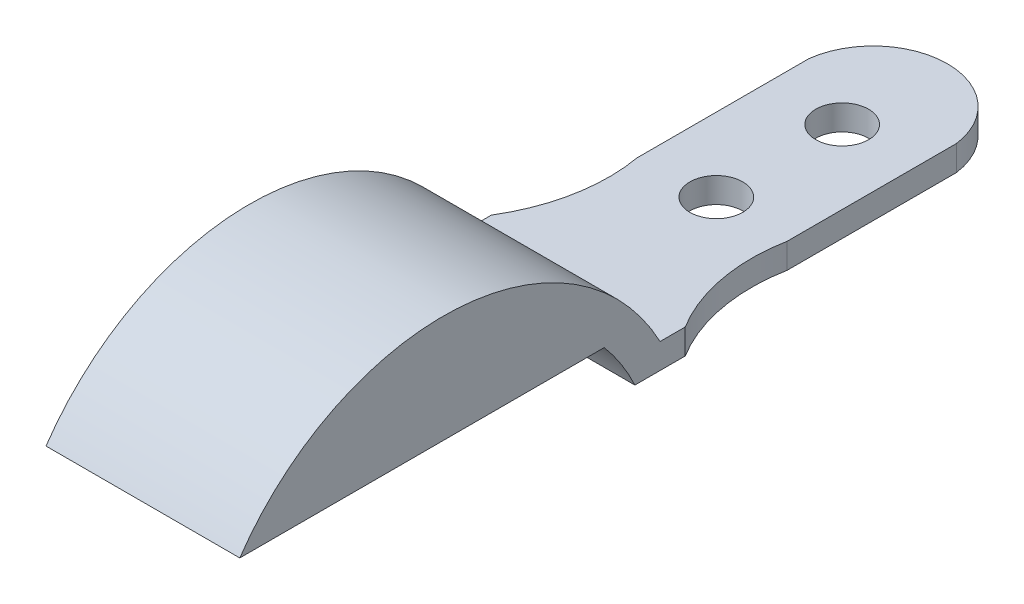
ISO-10303-21;
HEADER;
FILE_DESCRIPTION(('STEP AP214'),'2;1');
FILE_NAME('part.step','',(''),(''),'','','');
FILE_SCHEMA(('AUTOMOTIVE_DESIGN { 1 0 10303 214 1 1 1 1 }'));
ENDSEC;
DATA;
#1=APPLICATION_CONTEXT('core data for automotive mechanical design processes');
#2=APPLICATION_PROTOCOL_DEFINITION('international standard','automotive_design',2000,#1);
#3=PRODUCT_CONTEXT('',#1,'mechanical');
#4=PRODUCT('Part','Part','',(#3));
#5=PRODUCT_RELATED_PRODUCT_CATEGORY('part','',(#4));
#6=PRODUCT_DEFINITION_FORMATION('','',#4);
#7=PRODUCT_DEFINITION_CONTEXT('part definition',#1,'design');
#8=PRODUCT_DEFINITION('design','',#6,#7);
#9=PRODUCT_DEFINITION_SHAPE('','',#8);
#10=(LENGTH_UNIT() NAMED_UNIT(*) SI_UNIT(.MILLI.,.METRE.));
#11=(NAMED_UNIT(*) PLANE_ANGLE_UNIT() SI_UNIT($,.RADIAN.));
#12=(NAMED_UNIT(*) SI_UNIT($,.STERADIAN.) SOLID_ANGLE_UNIT());
#13=UNCERTAINTY_MEASURE_WITH_UNIT(LENGTH_MEASURE(1.E-05),#10,'distance_accuracy_value','');
#14=(GEOMETRIC_REPRESENTATION_CONTEXT(3) GLOBAL_UNCERTAINTY_ASSIGNED_CONTEXT((#13)) GLOBAL_UNIT_ASSIGNED_CONTEXT((#10,
#11,#12)) REPRESENTATION_CONTEXT('',''));
#15=CARTESIAN_POINT('',(0.,0.,0.));
#16=DIRECTION('',(0.,0.,1.));
#17=DIRECTION('',(1.,0.,0.));
#18=AXIS2_PLACEMENT_3D('',#15,#16,#17);
#19=CARTESIAN_POINT('',(-24.9448371820992,2.54,3.63807390383778));
#20=DIRECTION('',(0.,-1.,0.));
#21=DIRECTION('',(0.,0.,-1.));
#22=AXIS2_PLACEMENT_3D('',#19,#20,#21);
#23=PLANE('',#22);
#24=CARTESIAN_POINT('',(-24.9448371820992,2.54,3.63807390383778));
#25=DIRECTION('',(0.,-1.,0.));
#26=DIRECTION('',(0.,0.,-1.));
#27=AXIS2_PLACEMENT_3D('',#24,#25,#26);
#28=CIRCLE('',#27,17.78);
#29=CARTESIAN_POINT('',(-7.43137932869504,2.54,0.57095897005472));
#30=VERTEX_POINT('',#29);
#31=CARTESIAN_POINT('',(-9.779,2.54,12.9184716628811));
#32=VERTEX_POINT('',#31);
#33=EDGE_CURVE('E174',#30,#32,#28,.T.);
#34=ORIENTED_EDGE('',*,*,#33,.T.);
#35=DIRECTION('',(0.,0.,1.));
#36=VECTOR('',#35,1.);
#37=CARTESIAN_POINT('',(-9.779,2.54,12.9184716628811));
#38=LINE('',#37,#36);
#39=CARTESIAN_POINT('',(-9.779,2.54,15.4584716628811));
#40=VERTEX_POINT('',#39);
#41=EDGE_CURVE('E228',#32,#40,#38,.T.);
#42=ORIENTED_EDGE('',*,*,#41,.T.);
#43=DIRECTION('',(-1.,0.,0.));
#44=VECTOR('',#43,1.);
#45=CARTESIAN_POINT('',(9.779,2.54,15.4584716628811));
#46=LINE('',#45,#44);
#47=CARTESIAN_POINT('',(9.779,2.54,15.4584716628811));
#48=VERTEX_POINT('',#47);
#49=EDGE_CURVE('E159',#48,#40,#46,.T.);
#50=ORIENTED_EDGE('',*,*,#49,.F.);
#51=DIRECTION('',(0.,0.,1.));
#52=VECTOR('',#51,1.);
#53=CARTESIAN_POINT('',(9.779,2.54,12.9184716628811));
#54=LINE('',#53,#52);
#55=CARTESIAN_POINT('',(9.779,2.54,12.9184716628811));
#56=VERTEX_POINT('',#55);
#57=EDGE_CURVE('E144',#56,#48,#54,.T.);
#58=ORIENTED_EDGE('',*,*,#57,.F.);
#59=CARTESIAN_POINT('',(24.9057777512748,2.54,3.57454342773621));
#60=DIRECTION('',(0.,-1.,0.));
#61=DIRECTION('',(0.,0.,1.));
#62=AXIS2_PLACEMENT_3D('',#59,#60,#61);
#63=CIRCLE('',#62,17.78);
#64=CARTESIAN_POINT('',(7.43137932869504,2.54,0.292196741454784));
#65=VERTEX_POINT('',#64);
#66=EDGE_CURVE('E176',#56,#65,#63,.T.);
#67=ORIENTED_EDGE('',*,*,#66,.T.);
#68=DIRECTION('',(0.,0.,-1.));
#69=VECTOR('',#68,1.);
#70=CARTESIAN_POINT('',(7.43137932869504,2.54,0.292196741454784));
#71=LINE('',#70,#69);
#72=CARTESIAN_POINT('',(7.43137932869504,2.54,-16.7964623756184));
#73=VERTEX_POINT('',#72);
#74=EDGE_CURVE('E179',#65,#73,#71,.T.);
#75=ORIENTED_EDGE('',*,*,#74,.T.);
#76=CARTESIAN_POINT('',(0.,2.54,-15.8224148406209));
#77=DIRECTION('',(0.,1.,0.));
#78=DIRECTION('',(0.,0.,-1.));
#79=AXIS2_PLACEMENT_3D('',#76,#77,#78);
#80=CIRCLE('',#79,7.49494278346344);
#81=CARTESIAN_POINT('',(-7.43137932869504,2.54,-16.7964623756184));
#82=VERTEX_POINT('',#81);
#83=EDGE_CURVE('E181',#73,#82,#80,.T.);
#84=ORIENTED_EDGE('',*,*,#83,.T.);
#85=DIRECTION('',(0.,0.,1.));
#86=VECTOR('',#85,1.);
#87=CARTESIAN_POINT('',(-7.43137932869504,2.54,0.57095897005472));
#88=LINE('',#87,#86);
#89=EDGE_CURVE('E183',#82,#30,#88,.T.);
#90=ORIENTED_EDGE('',*,*,#89,.T.);
#91=EDGE_LOOP('',(#34,#42,#50,#58,#67,#75,#84,#90));
#92=FACE_BOUND('',#91,.T.);
#93=CARTESIAN_POINT('',(0.,2.54,0.));
#94=DIRECTION('',(0.,1.,0.));
#95=DIRECTION('',(0.,0.,1.));
#96=AXIS2_PLACEMENT_3D('',#93,#94,#95);
#97=CIRCLE('',#96,2.667);
#98=CARTESIAN_POINT('',(0.,2.54,2.667));
#99=VERTEX_POINT('',#98);
#100=EDGE_CURVE('E168',#99,#99,#97,.T.);
#101=ORIENTED_EDGE('',*,*,#100,.F.);
#102=EDGE_LOOP('',(#101));
#103=FACE_BOUND('',#102,.T.);
#104=CARTESIAN_POINT('',(0.,2.54,-12.7));
#105=DIRECTION('',(0.,1.,0.));
#106=DIRECTION('',(0.,0.,1.));
#107=AXIS2_PLACEMENT_3D('',#104,#105,#106);
#108=CIRCLE('',#107,2.667);
#109=CARTESIAN_POINT('',(0.,2.54,-10.033));
#110=VERTEX_POINT('',#109);
#111=EDGE_CURVE('E162',#110,#110,#108,.T.);
#112=ORIENTED_EDGE('',*,*,#111,.F.);
#113=EDGE_LOOP('',(#112));
#114=FACE_BOUND('',#113,.T.);
#115=ADVANCED_FACE('F33',(#92,#103,#114),#23,.F.);
#116=CARTESIAN_POINT('',(-24.9448371820992,0.,3.63807390383778));
#117=DIRECTION('',(0.,-1.,0.));
#118=DIRECTION('',(0.,0.,-1.));
#119=AXIS2_PLACEMENT_3D('',#116,#117,#118);
#120=PLANE('',#119);
#121=CARTESIAN_POINT('',(0.,0.,0.));
#122=DIRECTION('',(0.,1.,0.));
#123=DIRECTION('',(0.,0.,1.));
#124=AXIS2_PLACEMENT_3D('',#121,#122,#123);
#125=CIRCLE('',#124,2.667);
#126=CARTESIAN_POINT('',(0.,0.,2.667));
#127=VERTEX_POINT('',#126);
#128=EDGE_CURVE('E165',#127,#127,#125,.T.);
#129=ORIENTED_EDGE('',*,*,#128,.T.);
#130=EDGE_LOOP('',(#129));
#131=FACE_BOUND('',#130,.T.);
#132=CARTESIAN_POINT('',(-24.9448371820992,0.,3.63807390383778));
#133=DIRECTION('',(0.,-1.,0.));
#134=DIRECTION('',(0.,0.,-1.));
#135=AXIS2_PLACEMENT_3D('',#132,#133,#134);
#136=CIRCLE('',#135,17.78);
#137=CARTESIAN_POINT('',(-7.43137932869504,0.,0.57095897005472));
#138=VERTEX_POINT('',#137);
#139=CARTESIAN_POINT('',(-9.779,0.,12.9184716628811));
#140=VERTEX_POINT('',#139);
#141=EDGE_CURVE('E171',#138,#140,#136,.T.);
#142=ORIENTED_EDGE('',*,*,#141,.F.);
#143=DIRECTION('',(0.,0.,1.));
#144=VECTOR('',#143,1.);
#145=CARTESIAN_POINT('',(-7.43137932869504,0.,0.57095897005472));
#146=LINE('',#145,#144);
#147=CARTESIAN_POINT('',(-7.43137932869504,0.,-16.7964623756184));
#148=VERTEX_POINT('',#147);
#149=EDGE_CURVE('E177',#148,#138,#146,.T.);
#150=ORIENTED_EDGE('',*,*,#149,.F.);
#151=CARTESIAN_POINT('',(0.,0.,-15.8224148406209));
#152=DIRECTION('',(0.,1.,0.));
#153=DIRECTION('',(0.,0.,-1.));
#154=AXIS2_PLACEMENT_3D('',#151,#152,#153);
#155=CIRCLE('',#154,7.49494278346344);
#156=CARTESIAN_POINT('',(7.43137932869504,0.,-16.7964623756184));
#157=VERTEX_POINT('',#156);
#158=EDGE_CURVE('E191',#157,#148,#155,.T.);
#159=ORIENTED_EDGE('',*,*,#158,.F.);
#160=DIRECTION('',(0.,0.,-1.));
#161=VECTOR('',#160,1.);
#162=CARTESIAN_POINT('',(7.43137932869504,0.,0.292196741454784));
#163=LINE('',#162,#161);
#164=CARTESIAN_POINT('',(7.43137932869504,0.,0.292196741454784));
#165=VERTEX_POINT('',#164);
#166=EDGE_CURVE('E189',#165,#157,#163,.T.);
#167=ORIENTED_EDGE('',*,*,#166,.F.);
#168=CARTESIAN_POINT('',(24.9057777512748,0.,3.57454342773621));
#169=DIRECTION('',(0.,-1.,0.));
#170=DIRECTION('',(0.,0.,1.));
#171=AXIS2_PLACEMENT_3D('',#168,#169,#170);
#172=CIRCLE('',#171,17.78);
#173=CARTESIAN_POINT('',(9.779,0.,12.9184716628811));
#174=VERTEX_POINT('',#173);
#175=EDGE_CURVE('E187',#174,#165,#172,.T.);
#176=ORIENTED_EDGE('',*,*,#175,.F.);
#177=DIRECTION('',(0.,0.,-1.));
#178=VECTOR('',#177,1.);
#179=CARTESIAN_POINT('',(9.779,0.,12.9184716628811));
#180=LINE('',#179,#178);
#181=CARTESIAN_POINT('',(9.779,0.,17.9984716628811));
#182=VERTEX_POINT('',#181);
#183=EDGE_CURVE('E148',#182,#174,#180,.T.);
#184=ORIENTED_EDGE('',*,*,#183,.F.);
#185=DIRECTION('',(-1.,0.,0.));
#186=VECTOR('',#185,1.);
#187=CARTESIAN_POINT('',(9.779,0.,17.9984716628811));
#188=LINE('',#187,#186);
#189=CARTESIAN_POINT('',(-9.779,0.,17.9984716628811));
#190=VERTEX_POINT('',#189);
#191=EDGE_CURVE('E156',#182,#190,#188,.T.);
#192=ORIENTED_EDGE('',*,*,#191,.T.);
#193=DIRECTION('',(0.,0.,-1.));
#194=VECTOR('',#193,1.);
#195=CARTESIAN_POINT('',(-9.779,0.,12.9184716628811));
#196=LINE('',#195,#194);
#197=EDGE_CURVE('E150',#190,#140,#196,.T.);
#198=ORIENTED_EDGE('',*,*,#197,.T.);
#199=EDGE_LOOP('',(#142,#150,#159,#167,#176,#184,#192,#198));
#200=FACE_BOUND('',#199,.T.);
#201=CARTESIAN_POINT('',(0.,0.,-12.7));
#202=DIRECTION('',(0.,1.,0.));
#203=DIRECTION('',(0.,0.,1.));
#204=AXIS2_PLACEMENT_3D('',#201,#202,#203);
#205=CIRCLE('',#204,2.667);
#206=CARTESIAN_POINT('',(0.,0.,-10.033));
#207=VERTEX_POINT('',#206);
#208=EDGE_CURVE('E161',#207,#207,#205,.T.);
#209=ORIENTED_EDGE('',*,*,#208,.T.);
#210=EDGE_LOOP('',(#209));
#211=FACE_BOUND('',#210,.T.);
#212=ADVANCED_FACE('F212',(#131,#200,#211),#120,.T.);
#213=CARTESIAN_POINT('',(-24.9448371820992,2.54,3.63807390383778));
#214=DIRECTION('',(0.,-1.,0.));
#215=DIRECTION('',(0.,0.,-1.));
#216=AXIS2_PLACEMENT_3D('',#213,#214,#215);
#217=CYLINDRICAL_SURFACE('',#216,17.78);
#218=ORIENTED_EDGE('',*,*,#141,.T.);
#219=DIRECTION('',(0.,-1.,0.));
#220=VECTOR('',#219,1.);
#221=CARTESIAN_POINT('',(-9.779,2.54,12.9184716628811));
#222=LINE('',#221,#220);
#223=EDGE_CURVE('E11',#32,#140,#222,.T.);
#224=ORIENTED_EDGE('',*,*,#223,.F.);
#225=ORIENTED_EDGE('',*,*,#33,.F.);
#226=DIRECTION('',(0.,-1.,0.));
#227=VECTOR('',#226,1.);
#228=CARTESIAN_POINT('',(-7.43137932869504,2.54,0.57095897005472));
#229=LINE('',#228,#227);
#230=EDGE_CURVE('E185',#30,#138,#229,.T.);
#231=ORIENTED_EDGE('',*,*,#230,.T.);
#232=EDGE_LOOP('',(#218,#224,#225,#231));
#233=FACE_BOUND('',#232,.T.);
#234=ADVANCED_FACE('F35',(#233),#217,.F.);
#235=CARTESIAN_POINT('',(24.9057777512748,2.54,3.57454342773621));
#236=DIRECTION('',(0.,-1.,0.));
#237=DIRECTION('',(0.,0.,-1.));
#238=AXIS2_PLACEMENT_3D('',#235,#236,#237);
#239=CYLINDRICAL_SURFACE('',#238,17.78);
#240=ORIENTED_EDGE('',*,*,#175,.T.);
#241=DIRECTION('',(0.,-1.,0.));
#242=VECTOR('',#241,1.);
#243=CARTESIAN_POINT('',(7.43137932869504,2.54,0.292196741454784));
#244=LINE('',#243,#242);
#245=EDGE_CURVE('E202',#65,#165,#244,.T.);
#246=ORIENTED_EDGE('',*,*,#245,.F.);
#247=ORIENTED_EDGE('',*,*,#66,.F.);
#248=DIRECTION('',(0.,-1.,0.));
#249=VECTOR('',#248,1.);
#250=CARTESIAN_POINT('',(9.779,2.54,12.9184716628811));
#251=LINE('',#250,#249);
#252=EDGE_CURVE('E41',#56,#174,#251,.T.);
#253=ORIENTED_EDGE('',*,*,#252,.T.);
#254=EDGE_LOOP('',(#240,#246,#247,#253));
#255=FACE_BOUND('',#254,.T.);
#256=ADVANCED_FACE('F206',(#255),#239,.F.);
#257=CARTESIAN_POINT('',(7.43137932869504,2.54,0.292196741454784));
#258=DIRECTION('',(-1.,0.,0.));
#259=DIRECTION('',(0.,0.,1.));
#260=AXIS2_PLACEMENT_3D('',#257,#258,#259);
#261=PLANE('',#260);
#262=ORIENTED_EDGE('',*,*,#166,.T.);
#263=DIRECTION('',(0.,-1.,0.));
#264=VECTOR('',#263,1.);
#265=CARTESIAN_POINT('',(7.43137932869504,2.54,-16.7964623756184));
#266=LINE('',#265,#264);
#267=EDGE_CURVE('E199',#73,#157,#266,.T.);
#268=ORIENTED_EDGE('',*,*,#267,.F.);
#269=ORIENTED_EDGE('',*,*,#74,.F.);
#270=ORIENTED_EDGE('',*,*,#245,.T.);
#271=EDGE_LOOP('',(#262,#268,#269,#270));
#272=FACE_BOUND('',#271,.T.);
#273=ADVANCED_FACE('F263',(#272),#261,.F.);
#274=CARTESIAN_POINT('',(0.,2.54,-15.8224148406209));
#275=DIRECTION('',(0.,-1.,0.));
#276=DIRECTION('',(0.,0.,-1.));
#277=AXIS2_PLACEMENT_3D('',#274,#275,#276);
#278=CYLINDRICAL_SURFACE('',#277,7.49494278346344);
#279=ORIENTED_EDGE('',*,*,#158,.T.);
#280=DIRECTION('',(0.,-1.,0.));
#281=VECTOR('',#280,1.);
#282=CARTESIAN_POINT('',(-7.43137932869504,2.54,-16.7964623756184));
#283=LINE('',#282,#281);
#284=EDGE_CURVE('E196',#82,#148,#283,.T.);
#285=ORIENTED_EDGE('',*,*,#284,.F.);
#286=ORIENTED_EDGE('',*,*,#83,.F.);
#287=ORIENTED_EDGE('',*,*,#267,.T.);
#288=EDGE_LOOP('',(#279,#285,#286,#287));
#289=FACE_BOUND('',#288,.T.);
#290=ADVANCED_FACE('F259',(#289),#278,.T.);
#291=CARTESIAN_POINT('',(-7.43137932869504,2.54,0.57095897005472));
#292=DIRECTION('',(1.,0.,0.));
#293=DIRECTION('',(0.,0.,-1.));
#294=AXIS2_PLACEMENT_3D('',#291,#292,#293);
#295=PLANE('',#294);
#296=ORIENTED_EDGE('',*,*,#149,.T.);
#297=ORIENTED_EDGE('',*,*,#230,.F.);
#298=ORIENTED_EDGE('',*,*,#89,.F.);
#299=ORIENTED_EDGE('',*,*,#284,.T.);
#300=EDGE_LOOP('',(#296,#297,#298,#299));
#301=FACE_BOUND('',#300,.T.);
#302=ADVANCED_FACE('F255',(#301),#295,.F.);
#303=CARTESIAN_POINT('',(0.,2.54,0.));
#304=DIRECTION('',(0.,-1.,0.));
#305=DIRECTION('',(0.,0.,-1.));
#306=AXIS2_PLACEMENT_3D('',#303,#304,#305);
#307=CYLINDRICAL_SURFACE('',#306,2.667);
#308=ORIENTED_EDGE('',*,*,#100,.T.);
#309=EDGE_LOOP('',(#308));
#310=FACE_BOUND('',#309,.T.);
#311=ORIENTED_EDGE('',*,*,#128,.F.);
#312=EDGE_LOOP('',(#311));
#313=FACE_BOUND('',#312,.T.);
#314=ADVANCED_FACE('F279',(#310,#313),#307,.F.);
#315=CARTESIAN_POINT('',(0.,2.54,-12.7));
#316=DIRECTION('',(0.,-1.,0.));
#317=DIRECTION('',(0.,0.,-1.));
#318=AXIS2_PLACEMENT_3D('',#315,#316,#317);
#319=CYLINDRICAL_SURFACE('',#318,2.667);
#320=ORIENTED_EDGE('',*,*,#111,.T.);
#321=EDGE_LOOP('',(#320));
#322=FACE_BOUND('',#321,.T.);
#323=ORIENTED_EDGE('',*,*,#208,.F.);
#324=EDGE_LOOP('',(#323));
#325=FACE_BOUND('',#324,.T.);
#326=ADVANCED_FACE('F286',(#322,#325),#319,.F.);
#327=CARTESIAN_POINT('',(9.779,-9.09021373888474,37.3521488527746));
#328=DIRECTION('',(-1.,0.,0.));
#329=DIRECTION('',(0.,0.,1.));
#330=AXIS2_PLACEMENT_3D('',#327,#328,#329);
#331=CYLINDRICAL_SURFACE('',#330,24.791026047895);
#332=CARTESIAN_POINT('',(-9.779,-9.09021373888474,37.3521488527746));
#333=DIRECTION('',(1.,0.,0.));
#334=DIRECTION('',(0.,0.,1.));
#335=AXIS2_PLACEMENT_3D('',#332,#333,#334);
#336=CIRCLE('',#335,24.791026047895);
#337=CARTESIAN_POINT('',(-9.779,4.82600000000001,57.8688242092032));
#338=VERTEX_POINT('',#337);
#339=EDGE_CURVE('E139',#40,#338,#336,.T.);
#340=ORIENTED_EDGE('',*,*,#339,.T.);
#341=DIRECTION('',(-1.,0.,0.));
#342=VECTOR('',#341,1.);
#343=CARTESIAN_POINT('',(9.779,4.82600000000001,57.8688242092032));
#344=LINE('',#343,#342);
#345=CARTESIAN_POINT('',(9.779,4.82600000000001,57.8688242092032));
#346=VERTEX_POINT('',#345);
#347=EDGE_CURVE('E125',#346,#338,#344,.T.);
#348=ORIENTED_EDGE('',*,*,#347,.F.);
#349=CARTESIAN_POINT('',(9.779,-9.09021373888474,37.3521488527746));
#350=DIRECTION('',(1.,0.,0.));
#351=DIRECTION('',(0.,0.,1.));
#352=AXIS2_PLACEMENT_3D('',#349,#350,#351);
#353=CIRCLE('',#352,24.791026047895);
#354=EDGE_CURVE('E137',#48,#346,#353,.T.);
#355=ORIENTED_EDGE('',*,*,#354,.F.);
#356=ORIENTED_EDGE('',*,*,#49,.T.);
#357=EDGE_LOOP('',(#340,#348,#355,#356));
#358=FACE_BOUND('',#357,.T.);
#359=ADVANCED_FACE('F136',(#358),#331,.T.);
#360=CARTESIAN_POINT('',(9.779,-9.144,37.5564716628811));
#361=DIRECTION('',(-1.,0.,0.));
#362=DIRECTION('',(0.,0.,1.));
#363=AXIS2_PLACEMENT_3D('',#360,#361,#362);
#364=CYLINDRICAL_SURFACE('',#363,21.59);
#365=CARTESIAN_POINT('',(6.604,-9.144,37.5564716628811));
#366=DIRECTION('',(1.,0.,0.));
#367=DIRECTION('',(0.,0.,-1.));
#368=AXIS2_PLACEMENT_3D('',#365,#366,#367);
#369=CIRCLE('',#368,21.59);
#370=CARTESIAN_POINT('',(6.604,4.826,21.0953902889252));
#371=VERTEX_POINT('',#370);
#372=CARTESIAN_POINT('',(6.604,4.826,54.0175530368371));
#373=VERTEX_POINT('',#372);
#374=EDGE_CURVE('E131',#371,#373,#369,.T.);
#375=ORIENTED_EDGE('',*,*,#374,.T.);
#376=DIRECTION('',(-1.,0.,0.));
#377=VECTOR('',#376,1.);
#378=CARTESIAN_POINT('',(9.779,4.82600000000001,54.0175530368371));
#379=LINE('',#378,#377);
#380=CARTESIAN_POINT('',(-6.604,4.82600000000001,54.0175530368371));
#381=VERTEX_POINT('',#380);
#382=EDGE_CURVE('E132',#373,#381,#379,.T.);
#383=ORIENTED_EDGE('',*,*,#382,.T.);
#384=CARTESIAN_POINT('',(-6.604,-9.144,37.5564716628811));
#385=DIRECTION('',(-1.,0.,0.));
#386=DIRECTION('',(0.,0.,1.));
#387=AXIS2_PLACEMENT_3D('',#384,#385,#386);
#388=CIRCLE('',#387,21.59);
#389=CARTESIAN_POINT('',(-6.604,4.826,21.0953902889252));
#390=VERTEX_POINT('',#389);
#391=EDGE_CURVE('E56',#381,#390,#388,.T.);
#392=ORIENTED_EDGE('',*,*,#391,.T.);
#393=DIRECTION('',(-1.,0.,0.));
#394=VECTOR('',#393,1.);
#395=CARTESIAN_POINT('',(-6.604,4.826,21.0953902889252));
#396=LINE('',#395,#394);
#397=CARTESIAN_POINT('',(-9.779,4.826,21.0953902889252));
#398=VERTEX_POINT('',#397);
#399=EDGE_CURVE('E231',#390,#398,#396,.T.);
#400=ORIENTED_EDGE('',*,*,#399,.T.);
#401=CARTESIAN_POINT('',(-9.779,-9.144,37.5564716628811));
#402=DIRECTION('',(-1.,0.,0.));
#403=DIRECTION('',(0.,0.,1.));
#404=AXIS2_PLACEMENT_3D('',#401,#402,#403);
#405=CIRCLE('',#404,21.59);
#406=EDGE_CURVE('E218',#398,#190,#405,.T.);
#407=ORIENTED_EDGE('',*,*,#406,.T.);
#408=ORIENTED_EDGE('',*,*,#191,.F.);
#409=CARTESIAN_POINT('',(9.779,-9.144,37.5564716628811));
#410=DIRECTION('',(-1.,0.,0.));
#411=DIRECTION('',(0.,0.,1.));
#412=AXIS2_PLACEMENT_3D('',#409,#410,#411);
#413=CIRCLE('',#412,21.59);
#414=CARTESIAN_POINT('',(9.779,4.826,21.0953902889252));
#415=VERTEX_POINT('',#414);
#416=EDGE_CURVE('E146',#415,#182,#413,.T.);
#417=ORIENTED_EDGE('',*,*,#416,.F.);
#418=DIRECTION('',(1.,0.,0.));
#419=VECTOR('',#418,1.);
#420=CARTESIAN_POINT('',(6.604,4.826,21.0953902889252));
#421=LINE('',#420,#419);
#422=EDGE_CURVE('E129',#371,#415,#421,.T.);
#423=ORIENTED_EDGE('',*,*,#422,.F.);
#424=EDGE_LOOP('',(#375,#383,#392,#400,#407,#408,#417,#423));
#425=FACE_BOUND('',#424,.T.);
#426=ADVANCED_FACE('F217',(#425),#364,.F.);
#427=CARTESIAN_POINT('',(9.779,-9.144,37.5564716628811));
#428=DIRECTION('',(-1.,0.,0.));
#429=DIRECTION('',(0.,0.,1.));
#430=AXIS2_PLACEMENT_3D('',#427,#428,#429);
#431=PLANE('',#430);
#432=ORIENTED_EDGE('',*,*,#354,.T.);
#433=DIRECTION('',(0.,0.,-1.));
#434=VECTOR('',#433,1.);
#435=CARTESIAN_POINT('',(9.779,4.826,54.0175530368371));
#436=LINE('',#435,#434);
#437=EDGE_CURVE('E48',#346,#415,#436,.T.);
#438=ORIENTED_EDGE('',*,*,#437,.T.);
#439=ORIENTED_EDGE('',*,*,#416,.T.);
#440=ORIENTED_EDGE('',*,*,#183,.T.);
#441=ORIENTED_EDGE('',*,*,#252,.F.);
#442=ORIENTED_EDGE('',*,*,#57,.T.);
#443=EDGE_LOOP('',(#432,#438,#439,#440,#441,#442));
#444=FACE_BOUND('',#443,.T.);
#445=ADVANCED_FACE('F141',(#444),#431,.F.);
#446=CARTESIAN_POINT('',(-9.779,-9.144,37.5564716628811));
#447=DIRECTION('',(-1.,0.,0.));
#448=DIRECTION('',(0.,0.,1.));
#449=AXIS2_PLACEMENT_3D('',#446,#447,#448);
#450=PLANE('',#449);
#451=DIRECTION('',(0.,0.,1.));
#452=VECTOR('',#451,1.);
#453=CARTESIAN_POINT('',(-9.779,4.826,21.0953902889252));
#454=LINE('',#453,#452);
#455=EDGE_CURVE('E234',#398,#338,#454,.T.);
#456=ORIENTED_EDGE('',*,*,#455,.T.);
#457=ORIENTED_EDGE('',*,*,#339,.F.);
#458=ORIENTED_EDGE('',*,*,#41,.F.);
#459=ORIENTED_EDGE('',*,*,#223,.T.);
#460=ORIENTED_EDGE('',*,*,#197,.F.);
#461=ORIENTED_EDGE('',*,*,#406,.F.);
#462=EDGE_LOOP('',(#456,#457,#458,#459,#460,#461));
#463=FACE_BOUND('',#462,.T.);
#464=ADVANCED_FACE('F222',(#463),#450,.T.);
#465=CARTESIAN_POINT('',(-6.604,4.826,21.0953902889252));
#466=DIRECTION('',(0.,-1.,0.));
#467=DIRECTION('',(0.,0.,-1.));
#468=AXIS2_PLACEMENT_3D('',#465,#466,#467);
#469=PLANE('',#468);
#470=ORIENTED_EDGE('',*,*,#455,.F.);
#471=ORIENTED_EDGE('',*,*,#399,.F.);
#472=DIRECTION('',(0.,0.,1.));
#473=VECTOR('',#472,1.);
#474=CARTESIAN_POINT('',(-6.604,4.826,21.0953902889252));
#475=LINE('',#474,#473);
#476=EDGE_CURVE('E233',#390,#381,#475,.T.);
#477=ORIENTED_EDGE('',*,*,#476,.T.);
#478=ORIENTED_EDGE('',*,*,#382,.F.);
#479=DIRECTION('',(0.,0.,-1.));
#480=VECTOR('',#479,1.);
#481=CARTESIAN_POINT('',(6.604,4.826,54.0175530368371));
#482=LINE('',#481,#480);
#483=EDGE_CURVE('E239',#373,#371,#482,.T.);
#484=ORIENTED_EDGE('',*,*,#483,.T.);
#485=ORIENTED_EDGE('',*,*,#422,.T.);
#486=ORIENTED_EDGE('',*,*,#437,.F.);
#487=ORIENTED_EDGE('',*,*,#347,.T.);
#488=EDGE_LOOP('',(#470,#471,#477,#478,#484,#485,#486,#487));
#489=FACE_BOUND('',#488,.T.);
#490=ADVANCED_FACE('F124',(#489),#469,.T.);
#491=CARTESIAN_POINT('',(-6.604,-9.144,37.5564716628811));
#492=DIRECTION('',(-1.,0.,0.));
#493=DIRECTION('',(0.,0.,1.));
#494=AXIS2_PLACEMENT_3D('',#491,#492,#493);
#495=PLANE('',#494);
#496=ORIENTED_EDGE('',*,*,#391,.F.);
#497=ORIENTED_EDGE('',*,*,#476,.F.);
#498=EDGE_LOOP('',(#496,#497));
#499=FACE_BOUND('',#498,.T.);
#500=ADVANCED_FACE('F246',(#499),#495,.F.);
#501=CARTESIAN_POINT('',(6.604,-9.144,37.5564716628811));
#502=DIRECTION('',(1.,0.,0.));
#503=DIRECTION('',(0.,0.,-1.));
#504=AXIS2_PLACEMENT_3D('',#501,#502,#503);
#505=PLANE('',#504);
#506=ORIENTED_EDGE('',*,*,#374,.F.);
#507=ORIENTED_EDGE('',*,*,#483,.F.);
#508=EDGE_LOOP('',(#506,#507));
#509=FACE_BOUND('',#508,.T.);
#510=ADVANCED_FACE('F315',(#509),#505,.F.);
#511=CLOSED_SHELL('',(#115,#212,#234,#256,#273,#290,#302,#314,#326,#359,#426,#445,#464,#490,
#500,#510));
#512=MANIFOLD_SOLID_BREP('B2',#511);
#513=ADVANCED_BREP_SHAPE_REPRESENTATION('',(#18,#512),#14);
#514=SHAPE_DEFINITION_REPRESENTATION(#9,#513);
ENDSEC;
END-ISO-10303-21;
